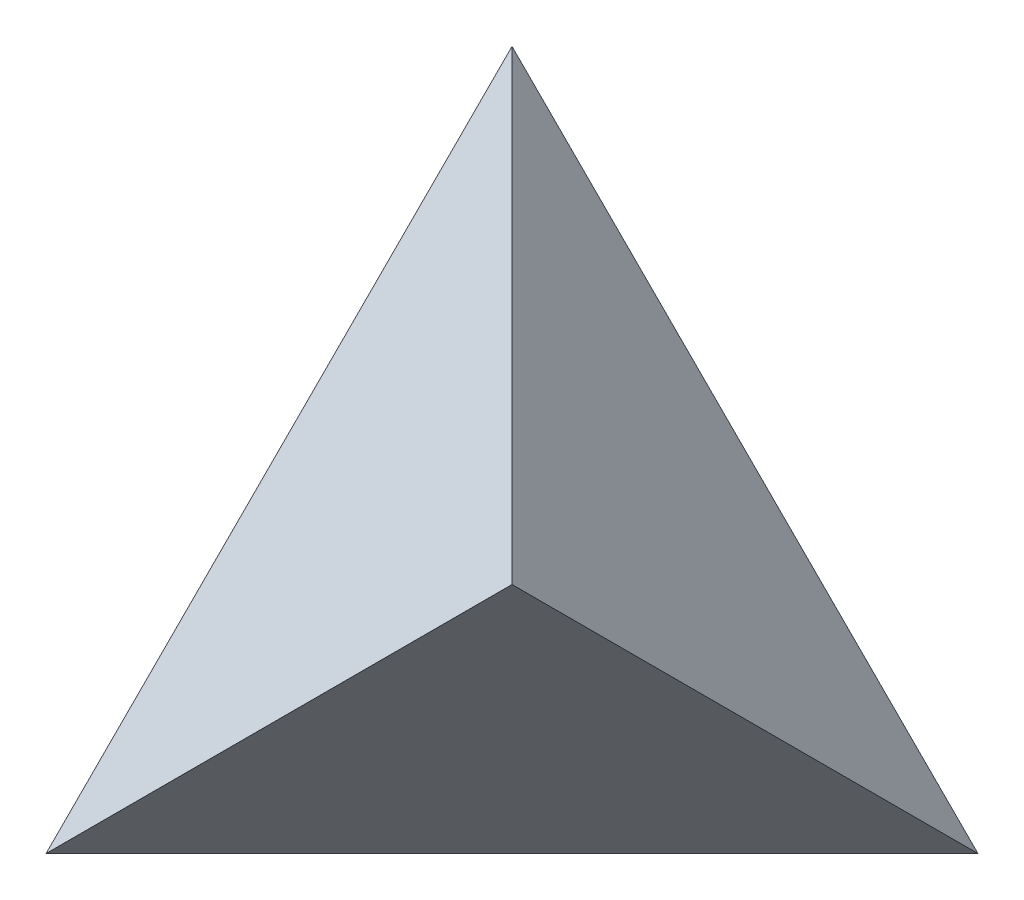
ISO-10303-21;
HEADER;
FILE_DESCRIPTION(('STEP AP214'),'2;1');
FILE_NAME('part.step','',(''),(''),'','','');
FILE_SCHEMA(('AUTOMOTIVE_DESIGN { 1 0 10303 214 1 1 1 1 }'));
ENDSEC;
DATA;
#1=APPLICATION_CONTEXT('core data for automotive mechanical design processes');
#2=APPLICATION_PROTOCOL_DEFINITION('international standard','automotive_design',2000,#1);
#3=PRODUCT_CONTEXT('',#1,'mechanical');
#4=PRODUCT('Part','Part','',(#3));
#5=PRODUCT_RELATED_PRODUCT_CATEGORY('part','',(#4));
#6=PRODUCT_DEFINITION_FORMATION('','',#4);
#7=PRODUCT_DEFINITION_CONTEXT('part definition',#1,'design');
#8=PRODUCT_DEFINITION('design','',#6,#7);
#9=PRODUCT_DEFINITION_SHAPE('','',#8);
#10=(LENGTH_UNIT() NAMED_UNIT(*) SI_UNIT(.MILLI.,.METRE.));
#11=(NAMED_UNIT(*) PLANE_ANGLE_UNIT() SI_UNIT($,.RADIAN.));
#12=(NAMED_UNIT(*) SI_UNIT($,.STERADIAN.) SOLID_ANGLE_UNIT());
#13=UNCERTAINTY_MEASURE_WITH_UNIT(LENGTH_MEASURE(1.E-05),#10,'distance_accuracy_value','');
#14=(GEOMETRIC_REPRESENTATION_CONTEXT(3) GLOBAL_UNCERTAINTY_ASSIGNED_CONTEXT((#13)) GLOBAL_UNIT_ASSIGNED_CONTEXT((#10,
#11,#12)) REPRESENTATION_CONTEXT('',''));
#15=CARTESIAN_POINT('',(0.,0.,0.));
#16=DIRECTION('',(0.,0.,1.));
#17=DIRECTION('',(1.,0.,0.));
#18=AXIS2_PLACEMENT_3D('',#15,#16,#17);
#19=CARTESIAN_POINT('',(8.66021777463969,-8.6602177746397,-8.66021777463969));
#20=DIRECTION('',(-0.577350269189626,-0.577350269189626,0.577350269189626));
#21=DIRECTION('',(0.707106781186547,0.,0.707106781186548));
#22=AXIS2_PLACEMENT_3D('',#19,#20,#21);
#23=PLANE('',#22);
#24=DIRECTION('',(-0.707106781186547,0.707106781186548,0.));
#25=VECTOR('',#24,1.);
#26=CARTESIAN_POINT('',(8.66021777463967,-8.66021777463969,-8.66021777463969));
#27=LINE('',#26,#25);
#28=CARTESIAN_POINT('',(8.66021777463969,-8.66021777463969,-8.66021777463969));
#29=VERTEX_POINT('',#28);
#30=CARTESIAN_POINT('',(-8.6602177746397,8.6602177746397,-8.66021777463969));
#31=VERTEX_POINT('',#30);
#32=EDGE_CURVE('E42',#29,#31,#27,.T.);
#33=ORIENTED_EDGE('',*,*,#32,.T.);
#34=DIRECTION('',(0.707106781186548,0.,0.707106781186547));
#35=VECTOR('',#34,1.);
#36=CARTESIAN_POINT('',(-8.66021777463971,8.66021777463968,-8.66021777463969));
#37=LINE('',#36,#35);
#38=CARTESIAN_POINT('',(8.6602177746397,8.66021777463969,8.66021777463969));
#39=VERTEX_POINT('',#38);
#40=EDGE_CURVE('E70',#31,#39,#37,.T.);
#41=ORIENTED_EDGE('',*,*,#40,.T.);
#42=DIRECTION('',(0.,-0.707106781186548,-0.707106781186547));
#43=VECTOR('',#42,1.);
#44=CARTESIAN_POINT('',(8.6602177746397,8.66021777463971,8.66021777463969));
#45=LINE('',#44,#43);
#46=EDGE_CURVE('E57',#39,#29,#45,.T.);
#47=ORIENTED_EDGE('',*,*,#46,.T.);
#48=EDGE_LOOP('',(#33,#41,#47));
#49=FACE_BOUND('',#48,.T.);
#50=ADVANCED_FACE('F39',(#49),#23,.F.);
#51=CARTESIAN_POINT('',(-8.66021777463971,-8.66021777463967,8.6602177746397));
#52=DIRECTION('',(0.577350269189626,0.577350269189625,0.577350269189626));
#53=DIRECTION('',(0.707106781186547,0.,-0.707106781186548));
#54=AXIS2_PLACEMENT_3D('',#51,#52,#53);
#55=PLANE('',#54);
#56=DIRECTION('',(0.,0.707106781186547,-0.707106781186548));
#57=VECTOR('',#56,1.);
#58=CARTESIAN_POINT('',(-8.66021777463969,-8.66021777463971,8.6602177746397));
#59=LINE('',#58,#57);
#60=CARTESIAN_POINT('',(-8.66021777463969,-8.66021777463969,8.66021777463969));
#61=VERTEX_POINT('',#60);
#62=EDGE_CURVE('E72',#61,#31,#59,.T.);
#63=ORIENTED_EDGE('',*,*,#62,.T.);
#64=ORIENTED_EDGE('',*,*,#32,.F.);
#65=DIRECTION('',(-0.707106781186547,0.,0.707106781186548));
#66=VECTOR('',#65,1.);
#67=CARTESIAN_POINT('',(8.6602177746397,-8.66021777463967,-8.66021777463969));
#68=LINE('',#67,#66);
#69=EDGE_CURVE('E49',#29,#61,#68,.T.);
#70=ORIENTED_EDGE('',*,*,#69,.T.);
#71=EDGE_LOOP('',(#63,#64,#70));
#72=FACE_BOUND('',#71,.T.);
#73=ADVANCED_FACE('F76',(#72),#55,.F.);
#74=CARTESIAN_POINT('',(-8.66021777463969,-8.6602177746397,8.66021777463969));
#75=DIRECTION('',(0.577350269189626,-0.577350269189626,-0.577350269189626));
#76=DIRECTION('',(-0.707106781186547,0.,-0.707106781186548));
#77=AXIS2_PLACEMENT_3D('',#74,#75,#76);
#78=PLANE('',#77);
#79=DIRECTION('',(0.707106781186547,0.707106781186548,0.));
#80=VECTOR('',#79,1.);
#81=CARTESIAN_POINT('',(-8.66021777463967,-8.66021777463969,8.66021777463969));
#82=LINE('',#81,#80);
#83=EDGE_CURVE('E11',#61,#39,#82,.T.);
#84=ORIENTED_EDGE('',*,*,#83,.T.);
#85=ORIENTED_EDGE('',*,*,#40,.F.);
#86=ORIENTED_EDGE('',*,*,#62,.F.);
#87=EDGE_LOOP('',(#84,#85,#86));
#88=FACE_BOUND('',#87,.T.);
#89=ADVANCED_FACE('F74',(#88),#78,.F.);
#90=CARTESIAN_POINT('',(8.66021777463971,-8.66021777463967,-8.6602177746397));
#91=DIRECTION('',(-0.577350269189626,0.577350269189625,-0.577350269189626));
#92=DIRECTION('',(-0.707106781186547,0.,0.707106781186548));
#93=AXIS2_PLACEMENT_3D('',#90,#91,#92);
#94=PLANE('',#93);
#95=ORIENTED_EDGE('',*,*,#46,.F.);
#96=ORIENTED_EDGE('',*,*,#83,.F.);
#97=ORIENTED_EDGE('',*,*,#69,.F.);
#98=EDGE_LOOP('',(#95,#96,#97));
#99=FACE_BOUND('',#98,.T.);
#100=ADVANCED_FACE('F113',(#99),#94,.F.);
#101=CLOSED_SHELL('',(#50,#73,#89,#100));
#102=MANIFOLD_SOLID_BREP('B2',#101);
#103=ADVANCED_BREP_SHAPE_REPRESENTATION('',(#18,#102),#14);
#104=SHAPE_DEFINITION_REPRESENTATION(#9,#103);
ENDSEC;
END-ISO-10303-21;
